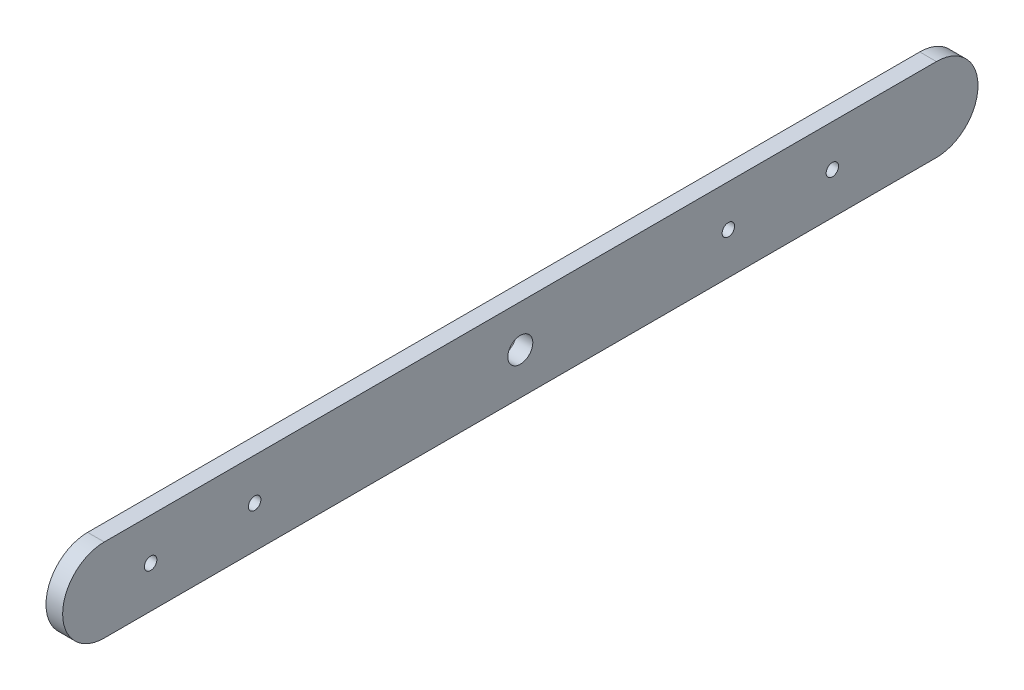
ISO-10303-21;
HEADER;
FILE_DESCRIPTION(('STEP AP214'),'2;1');
FILE_NAME('part.step','',(''),(''),'','','');
FILE_SCHEMA(('AUTOMOTIVE_DESIGN { 1 0 10303 214 1 1 1 1 }'));
ENDSEC;
DATA;
#1=APPLICATION_CONTEXT('core data for automotive mechanical design processes');
#2=APPLICATION_PROTOCOL_DEFINITION('international standard','automotive_design',2000,#1);
#3=PRODUCT_CONTEXT('',#1,'mechanical');
#4=PRODUCT('Part','Part','',(#3));
#5=PRODUCT_RELATED_PRODUCT_CATEGORY('part','',(#4));
#6=PRODUCT_DEFINITION_FORMATION('','',#4);
#7=PRODUCT_DEFINITION_CONTEXT('part definition',#1,'design');
#8=PRODUCT_DEFINITION('design','',#6,#7);
#9=PRODUCT_DEFINITION_SHAPE('','',#8);
#10=(LENGTH_UNIT() NAMED_UNIT(*) SI_UNIT(.MILLI.,.METRE.));
#11=(NAMED_UNIT(*) PLANE_ANGLE_UNIT() SI_UNIT($,.RADIAN.));
#12=(NAMED_UNIT(*) SI_UNIT($,.STERADIAN.) SOLID_ANGLE_UNIT());
#13=UNCERTAINTY_MEASURE_WITH_UNIT(LENGTH_MEASURE(1.E-05),#10,'distance_accuracy_value','');
#14=(GEOMETRIC_REPRESENTATION_CONTEXT(3) GLOBAL_UNCERTAINTY_ASSIGNED_CONTEXT((#13)) GLOBAL_UNIT_ASSIGNED_CONTEXT((#10,
#11,#12)) REPRESENTATION_CONTEXT('',''));
#15=CARTESIAN_POINT('',(0.,0.,0.));
#16=DIRECTION('',(0.,0.,1.));
#17=DIRECTION('',(1.,0.,0.));
#18=AXIS2_PLACEMENT_3D('',#15,#16,#17);
#19=CARTESIAN_POINT('',(4.,10.,-95.9447491632326));
#20=DIRECTION('',(1.,0.,0.));
#21=DIRECTION('',(0.,0.,-1.));
#22=AXIS2_PLACEMENT_3D('',#19,#20,#21);
#23=PLANE('',#22);
#24=CARTESIAN_POINT('',(4.,10.,92.9052508367674));
#25=DIRECTION('',(1.,0.,0.));
#26=DIRECTION('',(0.,0.,-1.));
#27=AXIS2_PLACEMENT_3D('',#24,#25,#26);
#28=CIRCLE('',#27,1.49999999999998);
#29=CARTESIAN_POINT('',(4.,10.,91.4052508367674));
#30=VERTEX_POINT('',#29);
#31=EDGE_CURVE('E153',#30,#30,#28,.T.);
#32=ORIENTED_EDGE('',*,*,#31,.F.);
#33=EDGE_LOOP('',(#32));
#34=FACE_BOUND('',#33,.T.);
#35=CARTESIAN_POINT('',(4.,10.,67.9052508367674));
#36=DIRECTION('',(1.,0.,0.));
#37=DIRECTION('',(0.,0.,-1.));
#38=AXIS2_PLACEMENT_3D('',#35,#36,#37);
#39=CIRCLE('',#38,1.49999999999998);
#40=CARTESIAN_POINT('',(4.,10.,66.4052508367674));
#41=VERTEX_POINT('',#40);
#42=EDGE_CURVE('E163',#41,#41,#39,.T.);
#43=ORIENTED_EDGE('',*,*,#42,.F.);
#44=EDGE_LOOP('',(#43));
#45=FACE_BOUND('',#44,.T.);
#46=CARTESIAN_POINT('',(4.,10.,-45.9447491632326));
#47=DIRECTION('',(1.,0.,0.));
#48=DIRECTION('',(0.,0.,-1.));
#49=AXIS2_PLACEMENT_3D('',#46,#47,#48);
#50=CIRCLE('',#49,1.5);
#51=CARTESIAN_POINT('',(4.,10.,-47.4447491632326));
#52=VERTEX_POINT('',#51);
#53=EDGE_CURVE('E169',#52,#52,#50,.T.);
#54=ORIENTED_EDGE('',*,*,#53,.F.);
#55=EDGE_LOOP('',(#54));
#56=FACE_BOUND('',#55,.T.);
#57=CARTESIAN_POINT('',(4.,10.,-70.9447491632326));
#58=DIRECTION('',(1.,0.,0.));
#59=DIRECTION('',(0.,0.,-1.));
#60=AXIS2_PLACEMENT_3D('',#57,#58,#59);
#61=CIRCLE('',#60,1.5);
#62=CARTESIAN_POINT('',(4.,10.,-72.4447491632326));
#63=VERTEX_POINT('',#62);
#64=EDGE_CURVE('E175',#63,#63,#61,.T.);
#65=ORIENTED_EDGE('',*,*,#64,.F.);
#66=EDGE_LOOP('',(#65));
#67=FACE_BOUND('',#66,.T.);
#68=DIRECTION('',(0.,0.,-1.));
#69=VECTOR('',#68,1.);
#70=CARTESIAN_POINT('',(4.,0.,0.));
#71=LINE('',#70,#69);
#72=CARTESIAN_POINT('',(4.,7.07767178198537E-13,104.055250836767));
#73=VERTEX_POINT('',#72);
#74=CARTESIAN_POINT('',(4.,0.,-95.9447491632326));
#75=VERTEX_POINT('',#74);
#76=EDGE_CURVE('E52',#73,#75,#71,.T.);
#77=ORIENTED_EDGE('',*,*,#76,.T.);
#78=CARTESIAN_POINT('',(4.,10.,-95.9447491632326));
#79=DIRECTION('',(1.,0.,0.));
#80=DIRECTION('',(0.,0.,-1.));
#81=AXIS2_PLACEMENT_3D('',#78,#79,#80);
#82=CIRCLE('',#81,10.);
#83=CARTESIAN_POINT('',(4.,20.,-95.9447491632326));
#84=VERTEX_POINT('',#83);
#85=EDGE_CURVE('E82',#75,#84,#82,.T.);
#86=ORIENTED_EDGE('',*,*,#85,.T.);
#87=DIRECTION('',(0.,0.,1.));
#88=VECTOR('',#87,1.);
#89=CARTESIAN_POINT('',(4.,20.,0.));
#90=LINE('',#89,#88);
#91=CARTESIAN_POINT('',(4.,20.0000000000007,104.055250836767));
#92=VERTEX_POINT('',#91);
#93=EDGE_CURVE('E86',#84,#92,#90,.T.);
#94=ORIENTED_EDGE('',*,*,#93,.T.);
#95=CARTESIAN_POINT('',(4.,10.0000000000007,104.055250836767));
#96=DIRECTION('',(1.,0.,0.));
#97=DIRECTION('',(0.,0.,1.));
#98=AXIS2_PLACEMENT_3D('',#95,#96,#97);
#99=CIRCLE('',#98,10.);
#100=EDGE_CURVE('E94',#92,#73,#99,.T.);
#101=ORIENTED_EDGE('',*,*,#100,.T.);
#102=EDGE_LOOP('',(#77,#86,#94,#101));
#103=FACE_BOUND('',#102,.T.);
#104=CARTESIAN_POINT('',(4.,10.,4.0552508367674));
#105=DIRECTION('',(1.,0.,0.));
#106=DIRECTION('',(0.,0.,-1.));
#107=AXIS2_PLACEMENT_3D('',#104,#105,#106);
#108=CIRCLE('',#107,3.);
#109=CARTESIAN_POINT('',(4.,10.,1.0552508367674));
#110=VERTEX_POINT('',#109);
#111=EDGE_CURVE('E101',#110,#110,#108,.T.);
#112=ORIENTED_EDGE('',*,*,#111,.F.);
#113=EDGE_LOOP('',(#112));
#114=FACE_BOUND('',#113,.T.);
#115=ADVANCED_FACE('F35',(#34,#45,#56,#67,#103,#114),#23,.T.);
#116=CARTESIAN_POINT('',(0.,10.,-95.9447491632326));
#117=DIRECTION('',(1.,0.,0.));
#118=DIRECTION('',(0.,0.,-1.));
#119=AXIS2_PLACEMENT_3D('',#116,#117,#118);
#120=PLANE('',#119);
#121=CARTESIAN_POINT('',(0.,10.,92.9052508367674));
#122=DIRECTION('',(-1.,0.,0.));
#123=DIRECTION('',(0.,0.,-1.));
#124=AXIS2_PLACEMENT_3D('',#121,#122,#123);
#125=CIRCLE('',#124,1.49999999999998);
#126=CARTESIAN_POINT('',(0.,10.,91.4052508367674));
#127=VERTEX_POINT('',#126);
#128=EDGE_CURVE('E156',#127,#127,#125,.T.);
#129=ORIENTED_EDGE('',*,*,#128,.F.);
#130=EDGE_LOOP('',(#129));
#131=FACE_BOUND('',#130,.T.);
#132=CARTESIAN_POINT('',(0.,10.,67.9052508367674));
#133=DIRECTION('',(-1.,0.,0.));
#134=DIRECTION('',(0.,0.,-1.));
#135=AXIS2_PLACEMENT_3D('',#132,#133,#134);
#136=CIRCLE('',#135,1.49999999999998);
#137=CARTESIAN_POINT('',(0.,10.,66.4052508367674));
#138=VERTEX_POINT('',#137);
#139=EDGE_CURVE('E158',#138,#138,#136,.T.);
#140=ORIENTED_EDGE('',*,*,#139,.F.);
#141=EDGE_LOOP('',(#140));
#142=FACE_BOUND('',#141,.T.);
#143=CARTESIAN_POINT('',(0.,10.,-45.9447491632326));
#144=DIRECTION('',(-1.,0.,0.));
#145=DIRECTION('',(0.,0.,1.));
#146=AXIS2_PLACEMENT_3D('',#143,#144,#145);
#147=CIRCLE('',#146,1.5);
#148=CARTESIAN_POINT('',(0.,10.,-44.4447491632326));
#149=VERTEX_POINT('',#148);
#150=EDGE_CURVE('E166',#149,#149,#147,.T.);
#151=ORIENTED_EDGE('',*,*,#150,.F.);
#152=EDGE_LOOP('',(#151));
#153=FACE_BOUND('',#152,.T.);
#154=CARTESIAN_POINT('',(0.,10.,-70.9447491632326));
#155=DIRECTION('',(-1.,0.,0.));
#156=DIRECTION('',(0.,0.,1.));
#157=AXIS2_PLACEMENT_3D('',#154,#155,#156);
#158=CIRCLE('',#157,1.5);
#159=CARTESIAN_POINT('',(0.,10.,-69.4447491632326));
#160=VERTEX_POINT('',#159);
#161=EDGE_CURVE('E172',#160,#160,#158,.T.);
#162=ORIENTED_EDGE('',*,*,#161,.F.);
#163=EDGE_LOOP('',(#162));
#164=FACE_BOUND('',#163,.T.);
#165=CARTESIAN_POINT('',(0.,10.,-95.9447491632326));
#166=DIRECTION('',(1.,0.,0.));
#167=DIRECTION('',(0.,0.,-1.));
#168=AXIS2_PLACEMENT_3D('',#165,#166,#167);
#169=CIRCLE('',#168,10.);
#170=CARTESIAN_POINT('',(0.,0.,-95.9447491632326));
#171=VERTEX_POINT('',#170);
#172=CARTESIAN_POINT('',(0.,20.,-95.9447491632326));
#173=VERTEX_POINT('',#172);
#174=EDGE_CURVE('E90',#171,#173,#169,.T.);
#175=ORIENTED_EDGE('',*,*,#174,.F.);
#176=DIRECTION('',(0.,0.,-1.));
#177=VECTOR('',#176,1.);
#178=CARTESIAN_POINT('',(0.,0.,0.));
#179=LINE('',#178,#177);
#180=CARTESIAN_POINT('',(0.,7.07767178198537E-13,104.055250836767));
#181=VERTEX_POINT('',#180);
#182=EDGE_CURVE('E104',#181,#171,#179,.T.);
#183=ORIENTED_EDGE('',*,*,#182,.F.);
#184=CARTESIAN_POINT('',(0.,10.0000000000007,104.055250836767));
#185=DIRECTION('',(1.,0.,0.));
#186=DIRECTION('',(0.,0.,1.));
#187=AXIS2_PLACEMENT_3D('',#184,#185,#186);
#188=CIRCLE('',#187,10.);
#189=CARTESIAN_POINT('',(0.,20.0000000000007,104.055250836767));
#190=VERTEX_POINT('',#189);
#191=EDGE_CURVE('E76',#190,#181,#188,.T.);
#192=ORIENTED_EDGE('',*,*,#191,.F.);
#193=DIRECTION('',(0.,0.,1.));
#194=VECTOR('',#193,1.);
#195=CARTESIAN_POINT('',(0.,20.,0.));
#196=LINE('',#195,#194);
#197=EDGE_CURVE('E69',#173,#190,#196,.T.);
#198=ORIENTED_EDGE('',*,*,#197,.F.);
#199=EDGE_LOOP('',(#175,#183,#192,#198));
#200=FACE_BOUND('',#199,.T.);
#201=CARTESIAN_POINT('',(0.,10.,4.0552508367674));
#202=DIRECTION('',(1.,0.,0.));
#203=DIRECTION('',(0.,0.,-1.));
#204=AXIS2_PLACEMENT_3D('',#201,#202,#203);
#205=CIRCLE('',#204,3.);
#206=CARTESIAN_POINT('',(0.,10.,1.0552508367674));
#207=VERTEX_POINT('',#206);
#208=EDGE_CURVE('E178',#207,#207,#205,.T.);
#209=ORIENTED_EDGE('',*,*,#208,.T.);
#210=EDGE_LOOP('',(#209));
#211=FACE_BOUND('',#210,.T.);
#212=ADVANCED_FACE('F110',(#131,#142,#153,#164,#200,#211),#120,.F.);
#213=CARTESIAN_POINT('',(4.,10.,-95.9447491632326));
#214=DIRECTION('',(-1.,0.,0.));
#215=DIRECTION('',(0.,0.,1.));
#216=AXIS2_PLACEMENT_3D('',#213,#214,#215);
#217=CYLINDRICAL_SURFACE('',#216,10.);
#218=ORIENTED_EDGE('',*,*,#174,.T.);
#219=DIRECTION('',(-1.,0.,0.));
#220=VECTOR('',#219,1.);
#221=CARTESIAN_POINT('',(4.,20.,-95.9447491632326));
#222=LINE('',#221,#220);
#223=EDGE_CURVE('E44',#84,#173,#222,.T.);
#224=ORIENTED_EDGE('',*,*,#223,.F.);
#225=ORIENTED_EDGE('',*,*,#85,.F.);
#226=DIRECTION('',(-1.,0.,0.));
#227=VECTOR('',#226,1.);
#228=CARTESIAN_POINT('',(4.,0.,-95.9447491632326));
#229=LINE('',#228,#227);
#230=EDGE_CURVE('E11',#75,#171,#229,.T.);
#231=ORIENTED_EDGE('',*,*,#230,.T.);
#232=EDGE_LOOP('',(#218,#224,#225,#231));
#233=FACE_BOUND('',#232,.T.);
#234=ADVANCED_FACE('F37',(#233),#217,.T.);
#235=CARTESIAN_POINT('',(4.,20.,0.));
#236=DIRECTION('',(0.,-1.,0.));
#237=DIRECTION('',(0.,0.,-1.));
#238=AXIS2_PLACEMENT_3D('',#235,#236,#237);
#239=PLANE('',#238);
#240=ORIENTED_EDGE('',*,*,#197,.T.);
#241=DIRECTION('',(-1.,0.,0.));
#242=VECTOR('',#241,1.);
#243=CARTESIAN_POINT('',(4.,20.0000000000007,104.055250836767));
#244=LINE('',#243,#242);
#245=EDGE_CURVE('E91',#92,#190,#244,.T.);
#246=ORIENTED_EDGE('',*,*,#245,.F.);
#247=ORIENTED_EDGE('',*,*,#93,.F.);
#248=ORIENTED_EDGE('',*,*,#223,.T.);
#249=EDGE_LOOP('',(#240,#246,#247,#248));
#250=FACE_BOUND('',#249,.T.);
#251=ADVANCED_FACE('F92',(#250),#239,.F.);
#252=CARTESIAN_POINT('',(4.,10.0000000000007,104.055250836767));
#253=DIRECTION('',(-1.,0.,0.));
#254=DIRECTION('',(0.,0.,1.));
#255=AXIS2_PLACEMENT_3D('',#252,#253,#254);
#256=CYLINDRICAL_SURFACE('',#255,10.);
#257=ORIENTED_EDGE('',*,*,#191,.T.);
#258=DIRECTION('',(-1.,0.,0.));
#259=VECTOR('',#258,1.);
#260=CARTESIAN_POINT('',(4.,7.07767178198537E-13,104.055250836767));
#261=LINE('',#260,#259);
#262=EDGE_CURVE('E96',#73,#181,#261,.T.);
#263=ORIENTED_EDGE('',*,*,#262,.F.);
#264=ORIENTED_EDGE('',*,*,#100,.F.);
#265=ORIENTED_EDGE('',*,*,#245,.T.);
#266=EDGE_LOOP('',(#257,#263,#264,#265));
#267=FACE_BOUND('',#266,.T.);
#268=ADVANCED_FACE('F107',(#267),#256,.T.);
#269=CARTESIAN_POINT('',(4.,0.,0.));
#270=DIRECTION('',(0.,1.,0.));
#271=DIRECTION('',(0.,0.,1.));
#272=AXIS2_PLACEMENT_3D('',#269,#270,#271);
#273=PLANE('',#272);
#274=ORIENTED_EDGE('',*,*,#182,.T.);
#275=ORIENTED_EDGE('',*,*,#230,.F.);
#276=ORIENTED_EDGE('',*,*,#76,.F.);
#277=ORIENTED_EDGE('',*,*,#262,.T.);
#278=EDGE_LOOP('',(#274,#275,#276,#277));
#279=FACE_BOUND('',#278,.T.);
#280=ADVANCED_FACE('F112',(#279),#273,.F.);
#281=CARTESIAN_POINT('',(4.,10.,4.0552508367674));
#282=DIRECTION('',(-1.,0.,0.));
#283=DIRECTION('',(0.,0.,1.));
#284=AXIS2_PLACEMENT_3D('',#281,#282,#283);
#285=CYLINDRICAL_SURFACE('',#284,3.);
#286=ORIENTED_EDGE('',*,*,#111,.T.);
#287=EDGE_LOOP('',(#286));
#288=FACE_BOUND('',#287,.T.);
#289=ORIENTED_EDGE('',*,*,#208,.F.);
#290=EDGE_LOOP('',(#289));
#291=FACE_BOUND('',#290,.T.);
#292=ADVANCED_FACE('F114',(#288,#291),#285,.F.);
#293=CARTESIAN_POINT('',(65.,10.,-70.9447491632326));
#294=DIRECTION('',(-1.,0.,0.));
#295=DIRECTION('',(0.,0.,1.));
#296=AXIS2_PLACEMENT_3D('',#293,#294,#295);
#297=CYLINDRICAL_SURFACE('',#296,1.5);
#298=ORIENTED_EDGE('',*,*,#64,.T.);
#299=EDGE_LOOP('',(#298));
#300=FACE_BOUND('',#299,.T.);
#301=ORIENTED_EDGE('',*,*,#161,.T.);
#302=EDGE_LOOP('',(#301));
#303=FACE_BOUND('',#302,.T.);
#304=ADVANCED_FACE('F120',(#300,#303),#297,.F.);
#305=CARTESIAN_POINT('',(65.,10.,-45.9447491632326));
#306=DIRECTION('',(-1.,0.,0.));
#307=DIRECTION('',(0.,0.,1.));
#308=AXIS2_PLACEMENT_3D('',#305,#306,#307);
#309=CYLINDRICAL_SURFACE('',#308,1.5);
#310=ORIENTED_EDGE('',*,*,#53,.T.);
#311=EDGE_LOOP('',(#310));
#312=FACE_BOUND('',#311,.T.);
#313=ORIENTED_EDGE('',*,*,#150,.T.);
#314=EDGE_LOOP('',(#313));
#315=FACE_BOUND('',#314,.T.);
#316=ADVANCED_FACE('F137',(#312,#315),#309,.F.);
#317=CARTESIAN_POINT('',(65.,10.,67.9052508367674));
#318=DIRECTION('',(-1.,0.,0.));
#319=DIRECTION('',(0.,0.,1.));
#320=AXIS2_PLACEMENT_3D('',#317,#318,#319);
#321=CYLINDRICAL_SURFACE('',#320,1.49999999999998);
#322=ORIENTED_EDGE('',*,*,#42,.T.);
#323=EDGE_LOOP('',(#322));
#324=FACE_BOUND('',#323,.T.);
#325=ORIENTED_EDGE('',*,*,#139,.T.);
#326=EDGE_LOOP('',(#325));
#327=FACE_BOUND('',#326,.T.);
#328=ADVANCED_FACE('F141',(#324,#327),#321,.F.);
#329=CARTESIAN_POINT('',(65.,10.,92.9052508367674));
#330=DIRECTION('',(-1.,0.,0.));
#331=DIRECTION('',(0.,0.,1.));
#332=AXIS2_PLACEMENT_3D('',#329,#330,#331);
#333=CYLINDRICAL_SURFACE('',#332,1.49999999999998);
#334=ORIENTED_EDGE('',*,*,#31,.T.);
#335=EDGE_LOOP('',(#334));
#336=FACE_BOUND('',#335,.T.);
#337=ORIENTED_EDGE('',*,*,#128,.T.);
#338=EDGE_LOOP('',(#337));
#339=FACE_BOUND('',#338,.T.);
#340=ADVANCED_FACE('F145',(#336,#339),#333,.F.);
#341=CLOSED_SHELL('',(#115,#212,#234,#251,#268,#280,#292,#304,#316,#328,#340));
#342=MANIFOLD_SOLID_BREP('B2',#341);
#343=ADVANCED_BREP_SHAPE_REPRESENTATION('',(#18,#342),#14);
#344=SHAPE_DEFINITION_REPRESENTATION(#9,#343);
ENDSEC;
END-ISO-10303-21;
